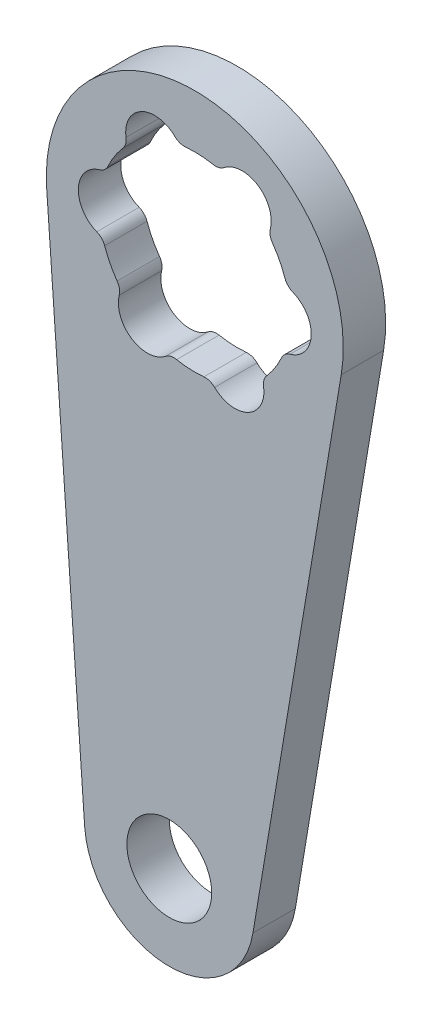
ISO-10303-21;
HEADER;
FILE_DESCRIPTION(('STEP AP214'),'2;1');
FILE_NAME('part.step','',(''),(''),'','','');
FILE_SCHEMA(('AUTOMOTIVE_DESIGN { 1 0 10303 214 1 1 1 1 }'));
ENDSEC;
DATA;
#1=APPLICATION_CONTEXT('core data for automotive mechanical design processes');
#2=APPLICATION_PROTOCOL_DEFINITION('international standard','automotive_design',2000,#1);
#3=PRODUCT_CONTEXT('',#1,'mechanical');
#4=PRODUCT('Part','Part','',(#3));
#5=PRODUCT_RELATED_PRODUCT_CATEGORY('part','',(#4));
#6=PRODUCT_DEFINITION_FORMATION('','',#4);
#7=PRODUCT_DEFINITION_CONTEXT('part definition',#1,'design');
#8=PRODUCT_DEFINITION('design','',#6,#7);
#9=PRODUCT_DEFINITION_SHAPE('','',#8);
#10=(LENGTH_UNIT() NAMED_UNIT(*) SI_UNIT(.MILLI.,.METRE.));
#11=(NAMED_UNIT(*) PLANE_ANGLE_UNIT() SI_UNIT($,.RADIAN.));
#12=(NAMED_UNIT(*) SI_UNIT($,.STERADIAN.) SOLID_ANGLE_UNIT());
#13=UNCERTAINTY_MEASURE_WITH_UNIT(LENGTH_MEASURE(1.E-05),#10,'distance_accuracy_value','');
#14=(GEOMETRIC_REPRESENTATION_CONTEXT(3) GLOBAL_UNCERTAINTY_ASSIGNED_CONTEXT((#13)) GLOBAL_UNIT_ASSIGNED_CONTEXT((#10,
#11,#12)) REPRESENTATION_CONTEXT('',''));
#15=CARTESIAN_POINT('',(0.,0.,0.));
#16=DIRECTION('',(0.,0.,1.));
#17=DIRECTION('',(1.,0.,0.));
#18=AXIS2_PLACEMENT_3D('',#15,#16,#17);
#19=CARTESIAN_POINT('',(0.,0.,6.35));
#20=DIRECTION('',(0.,0.,1.));
#21=DIRECTION('',(1.,0.,0.));
#22=AXIS2_PLACEMENT_3D('',#19,#20,#21);
#23=PLANE('',#22);
#24=CARTESIAN_POINT('',(593.076570191679,141.443139244974,6.35));
#25=DIRECTION('',(0.,0.,1.));
#26=DIRECTION('',(1.,0.,0.));
#27=AXIS2_PLACEMENT_3D('',#24,#25,#26);
#28=CIRCLE('',#27,12.7);
#29=CARTESIAN_POINT('',(580.408587851483,140.541904853447,6.35));
#30=VERTEX_POINT('',#29);
#31=CARTESIAN_POINT('',(605.602465963349,139.347444821335,6.35));
#32=VERTEX_POINT('',#31);
#33=EDGE_CURVE('E255',#30,#32,#28,.T.);
#34=ORIENTED_EDGE('',*,*,#33,.T.);
#35=DIRECTION('',(-0.165015308947933,-0.986291005643273,0.));
#36=VECTOR('',#35,1.);
#37=CARTESIAN_POINT('',(566.432648497293,-94.7692495979055,6.35));
#38=LINE('',#37,#36);
#39=CARTESIAN_POINT('',(618.815660151099,218.322266407784,6.35));
#40=VERTEX_POINT('',#39);
#41=EDGE_CURVE('E259',#40,#32,#38,.T.);
#42=ORIENTED_EDGE('',*,*,#41,.F.);
#43=CARTESIAN_POINT('',(596.895342550677,221.989731649152,6.35));
#44=DIRECTION('',(0.,0.,1.));
#45=DIRECTION('',(1.,0.,0.));
#46=AXIS2_PLACEMENT_3D('',#43,#44,#45);
#47=CIRCLE('',#46,22.225);
#48=CARTESIAN_POINT('',(574.726373455333,220.412571463979,6.35));
#49=VERTEX_POINT('',#48);
#50=EDGE_CURVE('E280',#40,#49,#47,.T.);
#51=ORIENTED_EDGE('',*,*,#50,.T.);
#52=DIRECTION('',(0.0709633379155479,-0.997478924424914,0.));
#53=VECTOR('',#52,1.);
#54=CARTESIAN_POINT('',(587.433948181567,41.7916336346723,6.35));
#55=LINE('',#54,#53);
#56=EDGE_CURVE('E261',#49,#30,#55,.T.);
#57=ORIENTED_EDGE('',*,*,#56,.T.);
#58=EDGE_LOOP('',(#34,#42,#51,#57));
#59=FACE_BOUND('',#58,.T.);
#60=CARTESIAN_POINT('',(593.076570191679,141.443139244974,6.35));
#61=DIRECTION('',(0.,0.,1.));
#62=DIRECTION('',(1.,0.,0.));
#63=AXIS2_PLACEMENT_3D('',#60,#61,#62);
#64=CIRCLE('',#63,6.34999999999994);
#65=CARTESIAN_POINT('',(599.426570191679,141.443139244974,6.35));
#66=VERTEX_POINT('',#65);
#67=EDGE_CURVE('E305',#66,#66,#64,.T.);
#68=ORIENTED_EDGE('',*,*,#67,.F.);
#69=EDGE_LOOP('',(#68));
#70=FACE_BOUND('',#69,.T.);
#71=CARTESIAN_POINT('',(603.982524474659,233.003358987227,6.35));
#72=DIRECTION('',(0.,0.,1.));
#73=DIRECTION('',(1.,0.,0.));
#74=AXIS2_PLACEMENT_3D('',#71,#72,#73);
#75=CIRCLE('',#74,4.35292499999991);
#76=CARTESIAN_POINT('',(608.204995238954,231.945674393266,6.35));
#77=VERTEX_POINT('',#76);
#78=CARTESIAN_POINT('',(601.270344718915,236.408067055205,6.35));
#79=VERTEX_POINT('',#78);
#80=EDGE_CURVE('E311',#77,#79,#75,.T.);
#81=ORIENTED_EDGE('',*,*,#80,.F.);
#82=CARTESIAN_POINT('',(610.176097565101,231.451933955531,6.35));
#83=DIRECTION('',(0.,0.,1.));
#84=DIRECTION('',(1.,0.,0.));
#85=AXIS2_PLACEMENT_3D('',#82,#83,#84);
#86=CIRCLE('',#85,2.032);
#87=CARTESIAN_POINT('',(608.521174821871,230.272843325452,6.35));
#88=VERTEX_POINT('',#87);
#89=EDGE_CURVE('E401',#77,#88,#86,.T.);
#90=ORIENTED_EDGE('',*,*,#89,.T.);
#91=CARTESIAN_POINT('',(596.895342550677,221.989731649152,6.35));
#92=DIRECTION('',(0.,0.,1.));
#93=DIRECTION('',(1.,0.,0.));
#94=AXIS2_PLACEMENT_3D('',#91,#92,#93);
#95=CIRCLE('',#94,14.2748000000001);
#96=CARTESIAN_POINT('',(610.391687265941,226.639311669622,6.35));
#97=VERTEX_POINT('',#96);
#98=EDGE_CURVE('E291',#97,#88,#95,.T.);
#99=ORIENTED_EDGE('',*,*,#98,.F.);
#100=CARTESIAN_POINT('',(612.312875125765,227.301173594244,6.35));
#101=DIRECTION('',(0.,0.,1.));
#102=DIRECTION('',(1.,0.,0.));
#103=AXIS2_PLACEMENT_3D('',#100,#101,#102);
#104=CIRCLE('',#103,2.032);
#105=CARTESIAN_POINT('',(611.569488376722,225.410036332873,6.35));
#106=VERTEX_POINT('',#105);
#107=EDGE_CURVE('E382',#97,#106,#104,.T.);
#108=ORIENTED_EDGE('',*,*,#107,.T.);
#109=CARTESIAN_POINT('',(609.977014575256,221.358865730779,6.35));
#110=DIRECTION('',(0.,0.,1.));
#111=DIRECTION('',(1.,0.,0.));
#112=AXIS2_PLACEMENT_3D('',#109,#110,#111);
#113=CIRCLE('',#112,4.35292500000003);
#114=CARTESIAN_POINT('',(611.172268229842,217.173256485182,6.35));
#115=VERTEX_POINT('',#114);
#116=EDGE_CURVE('E456',#115,#106,#113,.T.);
#117=ORIENTED_EDGE('',*,*,#116,.F.);
#118=CARTESIAN_POINT('',(611.730227630961,215.219361578412,6.35));
#119=DIRECTION('',(0.,0.,1.));
#120=DIRECTION('',(1.,0.,0.));
#121=AXIS2_PLACEMENT_3D('',#118,#119,#120);
#122=CIRCLE('',#121,2.032);
#123=CARTESIAN_POINT('',(609.881643820334,216.063021400311,6.35));
#124=VERTEX_POINT('',#123);
#125=EDGE_CURVE('E384',#115,#124,#122,.T.);
#126=ORIENTED_EDGE('',*,*,#125,.T.);
#127=CARTESIAN_POINT('',(607.670169322965,212.626344277736,6.35));
#128=VERTEX_POINT('',#127);
#129=EDGE_CURVE('E297',#128,#124,#95,.T.);
#130=ORIENTED_EDGE('',*,*,#129,.F.);
#131=CARTESIAN_POINT('',(609.203952493397,211.293477747997,6.35));
#132=DIRECTION('',(0.,0.,1.));
#133=DIRECTION('',(1.,0.,0.));
#134=AXIS2_PLACEMENT_3D('',#131,#132,#133);
#135=CIRCLE('',#134,2.032);
#136=CARTESIAN_POINT('',(607.194486208485,210.991700926819,6.35));
#137=VERTEX_POINT('',#136);
#138=EDGE_CURVE('E386',#128,#137,#135,.T.);
#139=ORIENTED_EDGE('',*,*,#138,.T.);
#140=CARTESIAN_POINT('',(602.889832651274,210.345238392703,6.35));
#141=DIRECTION('',(0.,0.,1.));
#142=DIRECTION('',(1.,0.,0.));
#143=AXIS2_PLACEMENT_3D('',#140,#141,#142);
#144=CIRCLE('',#143,4.35292499999991);
#145=CARTESIAN_POINT('',(599.862615541565,207.217313741068,6.35));
#146=VERTEX_POINT('',#145);
#147=EDGE_CURVE('E293',#146,#137,#144,.T.);
#148=ORIENTED_EDGE('',*,*,#147,.F.);
#149=CARTESIAN_POINT('',(598.449472616536,205.757159272033,6.35));
#150=DIRECTION('',(0.,0.,1.));
#151=DIRECTION('',(1.,0.,0.));
#152=AXIS2_PLACEMENT_3D('',#149,#150,#151);
#153=CIRCLE('',#152,2.032);
#154=CARTESIAN_POINT('',(598.255811549139,207.779909724011,6.35));
#155=VERTEX_POINT('',#154);
#156=EDGE_CURVE('E388',#146,#155,#153,.T.);
#157=ORIENTED_EDGE('',*,*,#156,.T.);
#158=CARTESIAN_POINT('',(594.1738246077,207.976764257266,6.35));
#159=VERTEX_POINT('',#158);
#160=EDGE_CURVE('E296',#159,#155,#95,.T.);
#161=ORIENTED_EDGE('',*,*,#160,.F.);
#162=CARTESIAN_POINT('',(593.786419918309,205.982035802905,6.35));
#163=DIRECTION('',(0.,0.,1.));
#164=DIRECTION('',(1.,0.,0.));
#165=AXIS2_PLACEMENT_3D('',#162,#163,#164);
#166=CIRCLE('',#165,2.032);
#167=CARTESIAN_POINT('',(592.520340382439,207.571396243099,6.35));
#168=VERTEX_POINT('',#167);
#169=EDGE_CURVE('E390',#159,#168,#166,.T.);
#170=ORIENTED_EDGE('',*,*,#169,.T.);
#171=CARTESIAN_POINT('',(589.808160626695,210.976104311076,6.35));
#172=DIRECTION('',(0.,0.,1.));
#173=DIRECTION('',(1.,0.,0.));
#174=AXIS2_PLACEMENT_3D('',#171,#172,#173);
#175=CIRCLE('',#174,4.35292499999991);
#176=CARTESIAN_POINT('',(585.5856898624,212.033788905038,6.35));
#177=VERTEX_POINT('',#176);
#178=EDGE_CURVE('E298',#177,#168,#175,.T.);
#179=ORIENTED_EDGE('',*,*,#178,.F.);
#180=CARTESIAN_POINT('',(583.614587536252,212.527529342773,6.35));
#181=DIRECTION('',(0.,0.,1.));
#182=DIRECTION('',(1.,0.,0.));
#183=AXIS2_PLACEMENT_3D('',#180,#181,#182);
#184=CIRCLE('',#183,2.032);
#185=CARTESIAN_POINT('',(585.269510279483,213.706619972851,6.35));
#186=VERTEX_POINT('',#185);
#187=EDGE_CURVE('E392',#177,#186,#184,.T.);
#188=ORIENTED_EDGE('',*,*,#187,.T.);
#189=CARTESIAN_POINT('',(583.398997835412,217.340151628682,6.35));
#190=VERTEX_POINT('',#189);
#191=EDGE_CURVE('E301',#190,#186,#95,.T.);
#192=ORIENTED_EDGE('',*,*,#191,.F.);
#193=CARTESIAN_POINT('',(581.477809975588,216.67828970406,6.35));
#194=DIRECTION('',(0.,0.,1.));
#195=DIRECTION('',(1.,0.,0.));
#196=AXIS2_PLACEMENT_3D('',#193,#194,#195);
#197=CIRCLE('',#196,2.032);
#198=CARTESIAN_POINT('',(582.221196724631,218.569426965431,6.35));
#199=VERTEX_POINT('',#198);
#200=EDGE_CURVE('E380',#190,#199,#197,.T.);
#201=ORIENTED_EDGE('',*,*,#200,.T.);
#202=CARTESIAN_POINT('',(583.813670526098,222.620597567525,6.35));
#203=DIRECTION('',(0.,0.,1.));
#204=DIRECTION('',(1.,0.,0.));
#205=AXIS2_PLACEMENT_3D('',#202,#203,#204);
#206=CIRCLE('',#205,4.35292499999991);
#207=CARTESIAN_POINT('',(582.618416871512,226.806206813121,6.35));
#208=VERTEX_POINT('',#207);
#209=EDGE_CURVE('E302',#208,#199,#206,.T.);
#210=ORIENTED_EDGE('',*,*,#209,.F.);
#211=CARTESIAN_POINT('',(582.060457470393,228.760101719892,6.35));
#212=DIRECTION('',(0.,0.,1.));
#213=DIRECTION('',(1.,0.,0.));
#214=AXIS2_PLACEMENT_3D('',#211,#212,#213);
#215=CIRCLE('',#214,2.032);
#216=CARTESIAN_POINT('',(583.90904128102,227.916441897993,6.35));
#217=VERTEX_POINT('',#216);
#218=EDGE_CURVE('E394',#208,#217,#215,.T.);
#219=ORIENTED_EDGE('',*,*,#218,.T.);
#220=CARTESIAN_POINT('',(586.120515778389,231.353119020568,6.35));
#221=VERTEX_POINT('',#220);
#222=EDGE_CURVE('E292',#221,#217,#95,.T.);
#223=ORIENTED_EDGE('',*,*,#222,.F.);
#224=CARTESIAN_POINT('',(584.586732607957,232.685985550307,6.35));
#225=DIRECTION('',(0.,0.,1.));
#226=DIRECTION('',(1.,0.,0.));
#227=AXIS2_PLACEMENT_3D('',#224,#225,#226);
#228=CIRCLE('',#227,2.032);
#229=CARTESIAN_POINT('',(586.596198892869,232.987762371484,6.35));
#230=VERTEX_POINT('',#229);
#231=EDGE_CURVE('E396',#221,#230,#228,.T.);
#232=ORIENTED_EDGE('',*,*,#231,.T.);
#233=CARTESIAN_POINT('',(590.90085245008,233.6342249056,6.35));
#234=DIRECTION('',(0.,0.,1.));
#235=DIRECTION('',(1.,0.,0.));
#236=AXIS2_PLACEMENT_3D('',#233,#234,#235);
#237=CIRCLE('',#236,4.3529249999998);
#238=CARTESIAN_POINT('',(593.928069559789,236.762149557236,6.35));
#239=VERTEX_POINT('',#238);
#240=EDGE_CURVE('E286',#239,#230,#237,.T.);
#241=ORIENTED_EDGE('',*,*,#240,.F.);
#242=CARTESIAN_POINT('',(595.341212484817,238.22230402627,6.35));
#243=DIRECTION('',(0.,0.,1.));
#244=DIRECTION('',(1.,0.,0.));
#245=AXIS2_PLACEMENT_3D('',#242,#243,#244);
#246=CIRCLE('',#245,2.032);
#247=CARTESIAN_POINT('',(595.534873552214,236.199553574293,6.35));
#248=VERTEX_POINT('',#247);
#249=EDGE_CURVE('E84',#239,#248,#246,.T.);
#250=ORIENTED_EDGE('',*,*,#249,.T.);
#251=CARTESIAN_POINT('',(599.616860493654,236.002699041038,6.35));
#252=VERTEX_POINT('',#251);
#253=EDGE_CURVE('E289',#252,#248,#95,.T.);
#254=ORIENTED_EDGE('',*,*,#253,.F.);
#255=CARTESIAN_POINT('',(600.004265183045,237.997427495399,6.35));
#256=DIRECTION('',(0.,0.,1.));
#257=DIRECTION('',(1.,0.,0.));
#258=AXIS2_PLACEMENT_3D('',#255,#256,#257);
#259=CIRCLE('',#258,2.032);
#260=EDGE_CURVE('E399',#252,#79,#259,.T.);
#261=ORIENTED_EDGE('',*,*,#260,.T.);
#262=EDGE_LOOP('',(#81,#90,#99,#108,#117,#126,#130,#139,#148,#157,#161,#170,#179,#188,#192,#201,
#210,#219,#223,#232,#241,#250,#254,#261));
#263=FACE_BOUND('',#262,.T.);
#264=ADVANCED_FACE('F69',(#59,#70,#263),#23,.T.);
#265=CARTESIAN_POINT('',(0.,0.,0.));
#266=DIRECTION('',(0.,0.,1.));
#267=DIRECTION('',(1.,0.,0.));
#268=AXIS2_PLACEMENT_3D('',#265,#266,#267);
#269=PLANE('',#268);
#270=CARTESIAN_POINT('',(593.076570191679,141.443139244974,0.));
#271=DIRECTION('',(0.,0.,1.));
#272=DIRECTION('',(1.,0.,0.));
#273=AXIS2_PLACEMENT_3D('',#270,#271,#272);
#274=CIRCLE('',#273,12.7);
#275=CARTESIAN_POINT('',(580.408587851483,140.541904853447,0.));
#276=VERTEX_POINT('',#275);
#277=CARTESIAN_POINT('',(605.602465963349,139.347444821335,0.));
#278=VERTEX_POINT('',#277);
#279=EDGE_CURVE('E271',#276,#278,#274,.T.);
#280=ORIENTED_EDGE('',*,*,#279,.F.);
#281=DIRECTION('',(0.0709633379155479,-0.997478924424914,0.));
#282=VECTOR('',#281,1.);
#283=CARTESIAN_POINT('',(587.433948181567,41.7916336346723,0.));
#284=LINE('',#283,#282);
#285=CARTESIAN_POINT('',(574.726373455333,220.412571463979,0.));
#286=VERTEX_POINT('',#285);
#287=EDGE_CURVE('E315',#286,#276,#284,.T.);
#288=ORIENTED_EDGE('',*,*,#287,.F.);
#289=CARTESIAN_POINT('',(596.895342550677,221.989731649152,0.));
#290=DIRECTION('',(0.,0.,1.));
#291=DIRECTION('',(1.,0.,0.));
#292=AXIS2_PLACEMENT_3D('',#289,#290,#291);
#293=CIRCLE('',#292,22.225);
#294=CARTESIAN_POINT('',(618.815660151099,218.322266407784,0.));
#295=VERTEX_POINT('',#294);
#296=EDGE_CURVE('E313',#295,#286,#293,.T.);
#297=ORIENTED_EDGE('',*,*,#296,.F.);
#298=DIRECTION('',(-0.165015308947933,-0.986291005643273,0.));
#299=VECTOR('',#298,1.);
#300=CARTESIAN_POINT('',(566.432648497293,-94.7692495979055,0.));
#301=LINE('',#300,#299);
#302=EDGE_CURVE('E310',#295,#278,#301,.T.);
#303=ORIENTED_EDGE('',*,*,#302,.T.);
#304=EDGE_LOOP('',(#280,#288,#297,#303));
#305=FACE_BOUND('',#304,.T.);
#306=CARTESIAN_POINT('',(593.076570191679,141.443139244974,0.));
#307=DIRECTION('',(0.,0.,1.));
#308=DIRECTION('',(1.,0.,0.));
#309=AXIS2_PLACEMENT_3D('',#306,#307,#308);
#310=CIRCLE('',#309,6.34999999999994);
#311=CARTESIAN_POINT('',(599.426570191679,141.443139244974,0.));
#312=VERTEX_POINT('',#311);
#313=EDGE_CURVE('E265',#312,#312,#310,.T.);
#314=ORIENTED_EDGE('',*,*,#313,.T.);
#315=EDGE_LOOP('',(#314));
#316=FACE_BOUND('',#315,.T.);
#317=CARTESIAN_POINT('',(596.895342550677,221.989731649152,0.));
#318=DIRECTION('',(0.,0.,1.));
#319=DIRECTION('',(1.,0.,0.));
#320=AXIS2_PLACEMENT_3D('',#317,#318,#319);
#321=CIRCLE('',#320,14.2748000000001);
#322=CARTESIAN_POINT('',(610.391687265941,226.639311669622,0.));
#323=VERTEX_POINT('',#322);
#324=CARTESIAN_POINT('',(608.521174821871,230.272843325452,0.));
#325=VERTEX_POINT('',#324);
#326=EDGE_CURVE('E325',#323,#325,#321,.T.);
#327=ORIENTED_EDGE('',*,*,#326,.T.);
#328=CARTESIAN_POINT('',(610.176097565101,231.451933955531,0.));
#329=DIRECTION('',(0.,0.,1.));
#330=DIRECTION('',(1.,0.,0.));
#331=AXIS2_PLACEMENT_3D('',#328,#329,#330);
#332=CIRCLE('',#331,2.032);
#333=CARTESIAN_POINT('',(608.204995238954,231.945674393266,0.));
#334=VERTEX_POINT('',#333);
#335=EDGE_CURVE('E373',#325,#334,#332,.F.);
#336=ORIENTED_EDGE('',*,*,#335,.T.);
#337=CARTESIAN_POINT('',(603.982524474659,233.003358987227,0.));
#338=DIRECTION('',(0.,0.,1.));
#339=DIRECTION('',(1.,0.,0.));
#340=AXIS2_PLACEMENT_3D('',#337,#338,#339);
#341=CIRCLE('',#340,4.35292499999991);
#342=CARTESIAN_POINT('',(601.270344718915,236.408067055205,0.));
#343=VERTEX_POINT('',#342);
#344=EDGE_CURVE('E275',#343,#334,#341,.F.);
#345=ORIENTED_EDGE('',*,*,#344,.F.);
#346=CARTESIAN_POINT('',(600.004265183045,237.997427495399,0.));
#347=DIRECTION('',(0.,0.,1.));
#348=DIRECTION('',(1.,0.,0.));
#349=AXIS2_PLACEMENT_3D('',#346,#347,#348);
#350=CIRCLE('',#349,2.032);
#351=CARTESIAN_POINT('',(599.616860493654,236.002699041038,0.));
#352=VERTEX_POINT('',#351);
#353=EDGE_CURVE('E371',#343,#352,#350,.F.);
#354=ORIENTED_EDGE('',*,*,#353,.T.);
#355=CARTESIAN_POINT('',(595.534873552214,236.199553574293,0.));
#356=VERTEX_POINT('',#355);
#357=EDGE_CURVE('E320',#352,#356,#321,.T.);
#358=ORIENTED_EDGE('',*,*,#357,.T.);
#359=CARTESIAN_POINT('',(595.341212484817,238.22230402627,0.));
#360=DIRECTION('',(0.,0.,1.));
#361=DIRECTION('',(1.,0.,0.));
#362=AXIS2_PLACEMENT_3D('',#359,#360,#361);
#363=CIRCLE('',#362,2.032);
#364=CARTESIAN_POINT('',(593.928069559789,236.762149557236,0.));
#365=VERTEX_POINT('',#364);
#366=EDGE_CURVE('E369',#356,#365,#363,.F.);
#367=ORIENTED_EDGE('',*,*,#366,.T.);
#368=CARTESIAN_POINT('',(590.90085245008,233.6342249056,0.));
#369=DIRECTION('',(0.,0.,1.));
#370=DIRECTION('',(1.,0.,0.));
#371=AXIS2_PLACEMENT_3D('',#368,#369,#370);
#372=CIRCLE('',#371,4.3529249999998);
#373=CARTESIAN_POINT('',(586.596198892869,232.987762371484,0.));
#374=VERTEX_POINT('',#373);
#375=EDGE_CURVE('E317',#365,#374,#372,.T.);
#376=ORIENTED_EDGE('',*,*,#375,.T.);
#377=CARTESIAN_POINT('',(584.586732607957,232.685985550307,0.));
#378=DIRECTION('',(0.,0.,1.));
#379=DIRECTION('',(1.,0.,0.));
#380=AXIS2_PLACEMENT_3D('',#377,#378,#379);
#381=CIRCLE('',#380,2.032);
#382=CARTESIAN_POINT('',(586.120515778389,231.353119020568,0.));
#383=VERTEX_POINT('',#382);
#384=EDGE_CURVE('E367',#374,#383,#381,.F.);
#385=ORIENTED_EDGE('',*,*,#384,.T.);
#386=CARTESIAN_POINT('',(583.90904128102,227.916441897993,0.));
#387=VERTEX_POINT('',#386);
#388=EDGE_CURVE('E336',#383,#387,#321,.T.);
#389=ORIENTED_EDGE('',*,*,#388,.T.);
#390=CARTESIAN_POINT('',(582.060457470393,228.760101719892,0.));
#391=DIRECTION('',(0.,0.,1.));
#392=DIRECTION('',(1.,0.,0.));
#393=AXIS2_PLACEMENT_3D('',#390,#391,#392);
#394=CIRCLE('',#393,2.032);
#395=CARTESIAN_POINT('',(582.618416871512,226.806206813121,0.));
#396=VERTEX_POINT('',#395);
#397=EDGE_CURVE('E365',#387,#396,#394,.F.);
#398=ORIENTED_EDGE('',*,*,#397,.T.);
#399=CARTESIAN_POINT('',(583.813670526098,222.620597567525,0.));
#400=DIRECTION('',(0.,0.,1.));
#401=DIRECTION('',(1.,0.,0.));
#402=AXIS2_PLACEMENT_3D('',#399,#400,#401);
#403=CIRCLE('',#402,4.35292499999991);
#404=CARTESIAN_POINT('',(582.221196724631,218.569426965431,0.));
#405=VERTEX_POINT('',#404);
#406=EDGE_CURVE('E333',#396,#405,#403,.T.);
#407=ORIENTED_EDGE('',*,*,#406,.T.);
#408=CARTESIAN_POINT('',(581.477809975588,216.67828970406,0.));
#409=DIRECTION('',(0.,0.,1.));
#410=DIRECTION('',(1.,0.,0.));
#411=AXIS2_PLACEMENT_3D('',#408,#409,#410);
#412=CIRCLE('',#411,2.032);
#413=CARTESIAN_POINT('',(583.398997835412,217.340151628682,0.));
#414=VERTEX_POINT('',#413);
#415=EDGE_CURVE('E351',#405,#414,#412,.F.);
#416=ORIENTED_EDGE('',*,*,#415,.T.);
#417=CARTESIAN_POINT('',(585.269510279483,213.706619972851,0.));
#418=VERTEX_POINT('',#417);
#419=EDGE_CURVE('E332',#414,#418,#321,.T.);
#420=ORIENTED_EDGE('',*,*,#419,.T.);
#421=CARTESIAN_POINT('',(583.614587536252,212.527529342773,0.));
#422=DIRECTION('',(0.,0.,1.));
#423=DIRECTION('',(1.,0.,0.));
#424=AXIS2_PLACEMENT_3D('',#421,#422,#423);
#425=CIRCLE('',#424,2.032);
#426=CARTESIAN_POINT('',(585.5856898624,212.033788905038,0.));
#427=VERTEX_POINT('',#426);
#428=EDGE_CURVE('E363',#418,#427,#425,.F.);
#429=ORIENTED_EDGE('',*,*,#428,.T.);
#430=CARTESIAN_POINT('',(589.808160626695,210.976104311076,0.));
#431=DIRECTION('',(0.,0.,1.));
#432=DIRECTION('',(1.,0.,0.));
#433=AXIS2_PLACEMENT_3D('',#430,#431,#432);
#434=CIRCLE('',#433,4.35292499999991);
#435=CARTESIAN_POINT('',(592.520340382439,207.571396243099,0.));
#436=VERTEX_POINT('',#435);
#437=EDGE_CURVE('E329',#427,#436,#434,.T.);
#438=ORIENTED_EDGE('',*,*,#437,.T.);
#439=CARTESIAN_POINT('',(593.786419918309,205.982035802905,0.));
#440=DIRECTION('',(0.,0.,1.));
#441=DIRECTION('',(1.,0.,0.));
#442=AXIS2_PLACEMENT_3D('',#439,#440,#441);
#443=CIRCLE('',#442,2.032);
#444=CARTESIAN_POINT('',(594.1738246077,207.976764257266,0.));
#445=VERTEX_POINT('',#444);
#446=EDGE_CURVE('E361',#436,#445,#443,.F.);
#447=ORIENTED_EDGE('',*,*,#446,.T.);
#448=CARTESIAN_POINT('',(598.255811549139,207.779909724011,0.));
#449=VERTEX_POINT('',#448);
#450=EDGE_CURVE('E326',#445,#449,#321,.T.);
#451=ORIENTED_EDGE('',*,*,#450,.T.);
#452=CARTESIAN_POINT('',(598.449472616536,205.757159272033,0.));
#453=DIRECTION('',(0.,0.,1.));
#454=DIRECTION('',(1.,0.,0.));
#455=AXIS2_PLACEMENT_3D('',#452,#453,#454);
#456=CIRCLE('',#455,2.032);
#457=CARTESIAN_POINT('',(599.862615541565,207.217313741068,0.));
#458=VERTEX_POINT('',#457);
#459=EDGE_CURVE('E359',#449,#458,#456,.F.);
#460=ORIENTED_EDGE('',*,*,#459,.T.);
#461=CARTESIAN_POINT('',(602.889832651274,210.345238392703,0.));
#462=DIRECTION('',(0.,0.,1.));
#463=DIRECTION('',(1.,0.,0.));
#464=AXIS2_PLACEMENT_3D('',#461,#462,#463);
#465=CIRCLE('',#464,4.35292499999991);
#466=CARTESIAN_POINT('',(607.194486208485,210.991700926819,0.));
#467=VERTEX_POINT('',#466);
#468=EDGE_CURVE('E324',#458,#467,#465,.T.);
#469=ORIENTED_EDGE('',*,*,#468,.T.);
#470=CARTESIAN_POINT('',(609.203952493397,211.293477747997,0.));
#471=DIRECTION('',(0.,0.,1.));
#472=DIRECTION('',(1.,0.,0.));
#473=AXIS2_PLACEMENT_3D('',#470,#471,#472);
#474=CIRCLE('',#473,2.032);
#475=CARTESIAN_POINT('',(607.670169322965,212.626344277736,0.));
#476=VERTEX_POINT('',#475);
#477=EDGE_CURVE('E357',#467,#476,#474,.F.);
#478=ORIENTED_EDGE('',*,*,#477,.T.);
#479=CARTESIAN_POINT('',(609.881643820334,216.063021400311,0.));
#480=VERTEX_POINT('',#479);
#481=EDGE_CURVE('E321',#476,#480,#321,.T.);
#482=ORIENTED_EDGE('',*,*,#481,.T.);
#483=CARTESIAN_POINT('',(611.730227630961,215.219361578412,0.));
#484=DIRECTION('',(0.,0.,1.));
#485=DIRECTION('',(1.,0.,0.));
#486=AXIS2_PLACEMENT_3D('',#483,#484,#485);
#487=CIRCLE('',#486,2.032);
#488=CARTESIAN_POINT('',(611.172268229842,217.173256485182,0.));
#489=VERTEX_POINT('',#488);
#490=EDGE_CURVE('E355',#480,#489,#487,.F.);
#491=ORIENTED_EDGE('',*,*,#490,.T.);
#492=CARTESIAN_POINT('',(609.977014575256,221.358865730779,0.));
#493=DIRECTION('',(0.,0.,1.));
#494=DIRECTION('',(1.,0.,0.));
#495=AXIS2_PLACEMENT_3D('',#492,#493,#494);
#496=CIRCLE('',#495,4.35292500000003);
#497=CARTESIAN_POINT('',(611.569488376722,225.410036332873,0.));
#498=VERTEX_POINT('',#497);
#499=EDGE_CURVE('E453',#489,#498,#496,.T.);
#500=ORIENTED_EDGE('',*,*,#499,.T.);
#501=CARTESIAN_POINT('',(612.312875125765,227.301173594244,0.));
#502=DIRECTION('',(0.,0.,1.));
#503=DIRECTION('',(1.,0.,0.));
#504=AXIS2_PLACEMENT_3D('',#501,#502,#503);
#505=CIRCLE('',#504,2.032);
#506=EDGE_CURVE('E353',#498,#323,#505,.F.);
#507=ORIENTED_EDGE('',*,*,#506,.T.);
#508=EDGE_LOOP('',(#327,#336,#345,#354,#358,#367,#376,#385,#389,#398,#407,#416,#420,#429,#438,
#447,#451,#460,#469,#478,#482,#491,#500,#507));
#509=FACE_BOUND('',#508,.T.);
#510=ADVANCED_FACE('F461',(#305,#316,#509),#269,.F.);
#511=CARTESIAN_POINT('',(590.90085245008,233.6342249056,6.35));
#512=DIRECTION('',(0.,0.,-1.));
#513=DIRECTION('',(-1.,0.,0.));
#514=AXIS2_PLACEMENT_3D('',#511,#512,#513);
#515=CYLINDRICAL_SURFACE('',#514,4.3529249999998);
#516=ORIENTED_EDGE('',*,*,#375,.F.);
#517=DIRECTION('',(0.,0.,-1.));
#518=VECTOR('',#517,1.);
#519=CARTESIAN_POINT('',(593.928069559789,236.762149557236,6.35));
#520=LINE('',#519,#518);
#521=EDGE_CURVE('E410',#365,#239,#520,.F.);
#522=ORIENTED_EDGE('',*,*,#521,.T.);
#523=ORIENTED_EDGE('',*,*,#240,.T.);
#524=DIRECTION('',(0.,0.,-1.));
#525=VECTOR('',#524,1.);
#526=CARTESIAN_POINT('',(586.596198892869,232.987762371484,6.35));
#527=LINE('',#526,#525);
#528=EDGE_CURVE('E407',#230,#374,#527,.T.);
#529=ORIENTED_EDGE('',*,*,#528,.T.);
#530=EDGE_LOOP('',(#516,#522,#523,#529));
#531=FACE_BOUND('',#530,.T.);
#532=ADVANCED_FACE('F539',(#531),#515,.F.);
#533=CARTESIAN_POINT('',(596.895342550677,221.989731649152,6.35));
#534=DIRECTION('',(0.,0.,-1.));
#535=DIRECTION('',(-1.,0.,0.));
#536=AXIS2_PLACEMENT_3D('',#533,#534,#535);
#537=CYLINDRICAL_SURFACE('',#536,14.2748000000001);
#538=ORIENTED_EDGE('',*,*,#357,.F.);
#539=DIRECTION('',(0.,0.,-1.));
#540=VECTOR('',#539,1.);
#541=CARTESIAN_POINT('',(599.616860493654,236.002699041038,6.35));
#542=LINE('',#541,#540);
#543=EDGE_CURVE('E91',#352,#252,#542,.F.);
#544=ORIENTED_EDGE('',*,*,#543,.T.);
#545=ORIENTED_EDGE('',*,*,#253,.T.);
#546=DIRECTION('',(0.,0.,-1.));
#547=VECTOR('',#546,1.);
#548=CARTESIAN_POINT('',(595.534873552214,236.199553574293,6.35));
#549=LINE('',#548,#547);
#550=EDGE_CURVE('E403',#248,#356,#549,.T.);
#551=ORIENTED_EDGE('',*,*,#550,.T.);
#552=EDGE_LOOP('',(#538,#544,#545,#551));
#553=FACE_BOUND('',#552,.T.);
#554=ADVANCED_FACE('F477',(#553),#537,.F.);
#555=ORIENTED_EDGE('',*,*,#98,.T.);
#556=DIRECTION('',(0.,0.,-1.));
#557=VECTOR('',#556,1.);
#558=CARTESIAN_POINT('',(608.521174821871,230.272843325452,6.35));
#559=LINE('',#558,#557);
#560=EDGE_CURVE('E348',#88,#325,#559,.T.);
#561=ORIENTED_EDGE('',*,*,#560,.T.);
#562=ORIENTED_EDGE('',*,*,#326,.F.);
#563=DIRECTION('',(0.,0.,-1.));
#564=VECTOR('',#563,1.);
#565=CARTESIAN_POINT('',(610.391687265941,226.639311669622,6.35));
#566=LINE('',#565,#564);
#567=EDGE_CURVE('E346',#323,#97,#566,.F.);
#568=ORIENTED_EDGE('',*,*,#567,.T.);
#569=EDGE_LOOP('',(#555,#561,#562,#568));
#570=FACE_BOUND('',#569,.T.);
#571=ADVANCED_FACE('F619',(#570),#537,.F.);
#572=ORIENTED_EDGE('',*,*,#481,.F.);
#573=DIRECTION('',(0.,0.,-1.));
#574=VECTOR('',#573,1.);
#575=CARTESIAN_POINT('',(607.670169322965,212.626344277736,6.35));
#576=LINE('',#575,#574);
#577=EDGE_CURVE('E445',#476,#128,#576,.F.);
#578=ORIENTED_EDGE('',*,*,#577,.T.);
#579=ORIENTED_EDGE('',*,*,#129,.T.);
#580=DIRECTION('',(0.,0.,-1.));
#581=VECTOR('',#580,1.);
#582=CARTESIAN_POINT('',(609.881643820334,216.063021400311,6.35));
#583=LINE('',#582,#581);
#584=EDGE_CURVE('E442',#124,#480,#583,.T.);
#585=ORIENTED_EDGE('',*,*,#584,.T.);
#586=EDGE_LOOP('',(#572,#578,#579,#585));
#587=FACE_BOUND('',#586,.T.);
#588=ADVANCED_FACE('F560',(#587),#537,.F.);
#589=CARTESIAN_POINT('',(602.889832651274,210.345238392703,6.35));
#590=DIRECTION('',(0.,0.,-1.));
#591=DIRECTION('',(-1.,0.,0.));
#592=AXIS2_PLACEMENT_3D('',#589,#590,#591);
#593=CYLINDRICAL_SURFACE('',#592,4.35292499999991);
#594=ORIENTED_EDGE('',*,*,#468,.F.);
#595=DIRECTION('',(0.,0.,-1.));
#596=VECTOR('',#595,1.);
#597=CARTESIAN_POINT('',(599.862615541565,207.217313741068,6.35));
#598=LINE('',#597,#596);
#599=EDGE_CURVE('E440',#458,#146,#598,.F.);
#600=ORIENTED_EDGE('',*,*,#599,.T.);
#601=ORIENTED_EDGE('',*,*,#147,.T.);
#602=DIRECTION('',(0.,0.,-1.));
#603=VECTOR('',#602,1.);
#604=CARTESIAN_POINT('',(607.194486208485,210.991700926819,6.35));
#605=LINE('',#604,#603);
#606=EDGE_CURVE('E437',#137,#467,#605,.T.);
#607=ORIENTED_EDGE('',*,*,#606,.T.);
#608=EDGE_LOOP('',(#594,#600,#601,#607));
#609=FACE_BOUND('',#608,.T.);
#610=ADVANCED_FACE('F557',(#609),#593,.F.);
#611=ORIENTED_EDGE('',*,*,#450,.F.);
#612=DIRECTION('',(0.,0.,-1.));
#613=VECTOR('',#612,1.);
#614=CARTESIAN_POINT('',(594.1738246077,207.976764257266,6.35));
#615=LINE('',#614,#613);
#616=EDGE_CURVE('E435',#445,#159,#615,.F.);
#617=ORIENTED_EDGE('',*,*,#616,.T.);
#618=ORIENTED_EDGE('',*,*,#160,.T.);
#619=DIRECTION('',(0.,0.,-1.));
#620=VECTOR('',#619,1.);
#621=CARTESIAN_POINT('',(598.255811549139,207.779909724011,6.35));
#622=LINE('',#621,#620);
#623=EDGE_CURVE('E432',#155,#449,#622,.T.);
#624=ORIENTED_EDGE('',*,*,#623,.T.);
#625=EDGE_LOOP('',(#611,#617,#618,#624));
#626=FACE_BOUND('',#625,.T.);
#627=ADVANCED_FACE('F488',(#626),#537,.F.);
#628=CARTESIAN_POINT('',(589.808160626695,210.976104311076,6.35));
#629=DIRECTION('',(0.,0.,-1.));
#630=DIRECTION('',(-1.,0.,0.));
#631=AXIS2_PLACEMENT_3D('',#628,#629,#630);
#632=CYLINDRICAL_SURFACE('',#631,4.35292499999991);
#633=ORIENTED_EDGE('',*,*,#437,.F.);
#634=DIRECTION('',(0.,0.,-1.));
#635=VECTOR('',#634,1.);
#636=CARTESIAN_POINT('',(585.5856898624,212.033788905038,6.35));
#637=LINE('',#636,#635);
#638=EDGE_CURVE('E430',#427,#177,#637,.F.);
#639=ORIENTED_EDGE('',*,*,#638,.T.);
#640=ORIENTED_EDGE('',*,*,#178,.T.);
#641=DIRECTION('',(0.,0.,-1.));
#642=VECTOR('',#641,1.);
#643=CARTESIAN_POINT('',(592.520340382439,207.571396243099,6.35));
#644=LINE('',#643,#642);
#645=EDGE_CURVE('E427',#168,#436,#644,.T.);
#646=ORIENTED_EDGE('',*,*,#645,.T.);
#647=EDGE_LOOP('',(#633,#639,#640,#646));
#648=FACE_BOUND('',#647,.T.);
#649=ADVANCED_FACE('F500',(#648),#632,.F.);
#650=ORIENTED_EDGE('',*,*,#191,.T.);
#651=DIRECTION('',(0.,0.,-1.));
#652=VECTOR('',#651,1.);
#653=CARTESIAN_POINT('',(585.269510279483,213.706619972851,6.35));
#654=LINE('',#653,#652);
#655=EDGE_CURVE('E424',#186,#418,#654,.T.);
#656=ORIENTED_EDGE('',*,*,#655,.T.);
#657=ORIENTED_EDGE('',*,*,#419,.F.);
#658=DIRECTION('',(0.,0.,-1.));
#659=VECTOR('',#658,1.);
#660=CARTESIAN_POINT('',(583.398997835412,217.340151628682,6.35));
#661=LINE('',#660,#659);
#662=EDGE_CURVE('E422',#414,#190,#661,.F.);
#663=ORIENTED_EDGE('',*,*,#662,.T.);
#664=EDGE_LOOP('',(#650,#656,#657,#663));
#665=FACE_BOUND('',#664,.T.);
#666=ADVANCED_FACE('F509',(#665),#537,.F.);
#667=CARTESIAN_POINT('',(583.813670526098,222.620597567525,6.35));
#668=DIRECTION('',(0.,0.,-1.));
#669=DIRECTION('',(-1.,0.,0.));
#670=AXIS2_PLACEMENT_3D('',#667,#668,#669);
#671=CYLINDRICAL_SURFACE('',#670,4.35292499999991);
#672=ORIENTED_EDGE('',*,*,#406,.F.);
#673=DIRECTION('',(0.,0.,-1.));
#674=VECTOR('',#673,1.);
#675=CARTESIAN_POINT('',(582.618416871512,226.806206813121,6.35));
#676=LINE('',#675,#674);
#677=EDGE_CURVE('E420',#396,#208,#676,.F.);
#678=ORIENTED_EDGE('',*,*,#677,.T.);
#679=ORIENTED_EDGE('',*,*,#209,.T.);
#680=DIRECTION('',(0.,0.,-1.));
#681=VECTOR('',#680,1.);
#682=CARTESIAN_POINT('',(582.221196724631,218.569426965431,6.35));
#683=LINE('',#682,#681);
#684=EDGE_CURVE('E417',#199,#405,#683,.T.);
#685=ORIENTED_EDGE('',*,*,#684,.T.);
#686=EDGE_LOOP('',(#672,#678,#679,#685));
#687=FACE_BOUND('',#686,.T.);
#688=ADVANCED_FACE('F524',(#687),#671,.F.);
#689=CARTESIAN_POINT('',(593.076570191679,141.443139244974,6.35));
#690=DIRECTION('',(0.,0.,-1.));
#691=DIRECTION('',(-1.,0.,0.));
#692=AXIS2_PLACEMENT_3D('',#689,#690,#691);
#693=CYLINDRICAL_SURFACE('',#692,12.7);
#694=ORIENTED_EDGE('',*,*,#279,.T.);
#695=DIRECTION('',(0.,0.,-1.));
#696=VECTOR('',#695,1.);
#697=CARTESIAN_POINT('',(605.602465963349,139.347444821335,6.35));
#698=LINE('',#697,#696);
#699=EDGE_CURVE('E268',#32,#278,#698,.T.);
#700=ORIENTED_EDGE('',*,*,#699,.F.);
#701=ORIENTED_EDGE('',*,*,#33,.F.);
#702=DIRECTION('',(0.,0.,-1.));
#703=VECTOR('',#702,1.);
#704=CARTESIAN_POINT('',(580.408587851483,140.541904853447,6.35));
#705=LINE('',#704,#703);
#706=EDGE_CURVE('E308',#30,#276,#705,.T.);
#707=ORIENTED_EDGE('',*,*,#706,.T.);
#708=EDGE_LOOP('',(#694,#700,#701,#707));
#709=FACE_BOUND('',#708,.T.);
#710=ADVANCED_FACE('F269',(#709),#693,.T.);
#711=CARTESIAN_POINT('',(566.432648497293,-94.7692495979055,6.35));
#712=DIRECTION('',(0.986291005643273,-0.165015308947933,0.));
#713=DIRECTION('',(0.165015308947933,0.986291005643273,0.));
#714=AXIS2_PLACEMENT_3D('',#711,#712,#713);
#715=PLANE('',#714);
#716=ORIENTED_EDGE('',*,*,#302,.F.);
#717=DIRECTION('',(0.,0.,-1.));
#718=VECTOR('',#717,1.);
#719=CARTESIAN_POINT('',(618.815660151099,218.322266407784,6.35));
#720=LINE('',#719,#718);
#721=EDGE_CURVE('E276',#40,#295,#720,.T.);
#722=ORIENTED_EDGE('',*,*,#721,.F.);
#723=ORIENTED_EDGE('',*,*,#41,.T.);
#724=ORIENTED_EDGE('',*,*,#699,.T.);
#725=EDGE_LOOP('',(#716,#722,#723,#724));
#726=FACE_BOUND('',#725,.T.);
#727=ADVANCED_FACE('F278',(#726),#715,.T.);
#728=CARTESIAN_POINT('',(596.895342550677,221.989731649152,6.35));
#729=DIRECTION('',(0.,0.,-1.));
#730=DIRECTION('',(-1.,0.,0.));
#731=AXIS2_PLACEMENT_3D('',#728,#729,#730);
#732=CYLINDRICAL_SURFACE('',#731,22.225);
#733=ORIENTED_EDGE('',*,*,#296,.T.);
#734=DIRECTION('',(0.,0.,-1.));
#735=VECTOR('',#734,1.);
#736=CARTESIAN_POINT('',(574.726373455333,220.412571463979,6.35));
#737=LINE('',#736,#735);
#738=EDGE_CURVE('E340',#49,#286,#737,.T.);
#739=ORIENTED_EDGE('',*,*,#738,.F.);
#740=ORIENTED_EDGE('',*,*,#50,.F.);
#741=ORIENTED_EDGE('',*,*,#721,.T.);
#742=EDGE_LOOP('',(#733,#739,#740,#741));
#743=FACE_BOUND('',#742,.T.);
#744=ADVANCED_FACE('F552',(#743),#732,.T.);
#745=ORIENTED_EDGE('',*,*,#388,.F.);
#746=DIRECTION('',(0.,0.,-1.));
#747=VECTOR('',#746,1.);
#748=CARTESIAN_POINT('',(586.120515778389,231.353119020568,6.35));
#749=LINE('',#748,#747);
#750=EDGE_CURVE('E415',#383,#221,#749,.F.);
#751=ORIENTED_EDGE('',*,*,#750,.T.);
#752=ORIENTED_EDGE('',*,*,#222,.T.);
#753=DIRECTION('',(0.,0.,-1.));
#754=VECTOR('',#753,1.);
#755=CARTESIAN_POINT('',(583.90904128102,227.916441897993,6.35));
#756=LINE('',#755,#754);
#757=EDGE_CURVE('E412',#217,#387,#756,.T.);
#758=ORIENTED_EDGE('',*,*,#757,.T.);
#759=EDGE_LOOP('',(#745,#751,#752,#758));
#760=FACE_BOUND('',#759,.T.);
#761=ADVANCED_FACE('F515',(#760),#537,.F.);
#762=CARTESIAN_POINT('',(587.433948181567,41.7916336346723,6.35));
#763=DIRECTION('',(0.997478924424914,0.0709633379155479,0.));
#764=DIRECTION('',(-0.0709633379155479,0.997478924424914,0.));
#765=AXIS2_PLACEMENT_3D('',#762,#763,#764);
#766=PLANE('',#765);
#767=ORIENTED_EDGE('',*,*,#287,.T.);
#768=ORIENTED_EDGE('',*,*,#706,.F.);
#769=ORIENTED_EDGE('',*,*,#56,.F.);
#770=ORIENTED_EDGE('',*,*,#738,.T.);
#771=EDGE_LOOP('',(#767,#768,#769,#770));
#772=FACE_BOUND('',#771,.T.);
#773=ADVANCED_FACE('F548',(#772),#766,.F.);
#774=CARTESIAN_POINT('',(593.076570191679,141.443139244974,6.35));
#775=DIRECTION('',(0.,0.,-1.));
#776=DIRECTION('',(-1.,0.,0.));
#777=AXIS2_PLACEMENT_3D('',#774,#775,#776);
#778=CYLINDRICAL_SURFACE('',#777,6.34999999999994);
#779=ORIENTED_EDGE('',*,*,#67,.T.);
#780=EDGE_LOOP('',(#779));
#781=FACE_BOUND('',#780,.T.);
#782=ORIENTED_EDGE('',*,*,#313,.F.);
#783=EDGE_LOOP('',(#782));
#784=FACE_BOUND('',#783,.T.);
#785=ADVANCED_FACE('F545',(#781,#784),#778,.F.);
#786=CARTESIAN_POINT('',(603.982524474659,233.003358987227,6.35));
#787=DIRECTION('',(0.,0.,-1.));
#788=DIRECTION('',(-1.,0.,0.));
#789=AXIS2_PLACEMENT_3D('',#786,#787,#788);
#790=CYLINDRICAL_SURFACE('',#789,4.35292499999991);
#791=ORIENTED_EDGE('',*,*,#344,.T.);
#792=DIRECTION('',(0.,0.,-1.));
#793=VECTOR('',#792,1.);
#794=CARTESIAN_POINT('',(608.204995238954,231.945674393266,6.35));
#795=LINE('',#794,#793);
#796=EDGE_CURVE('E378',#334,#77,#795,.F.);
#797=ORIENTED_EDGE('',*,*,#796,.T.);
#798=ORIENTED_EDGE('',*,*,#80,.T.);
#799=DIRECTION('',(0.,0.,-1.));
#800=VECTOR('',#799,1.);
#801=CARTESIAN_POINT('',(601.270344718915,236.408067055205,6.35));
#802=LINE('',#801,#800);
#803=EDGE_CURVE('E375',#79,#343,#802,.T.);
#804=ORIENTED_EDGE('',*,*,#803,.T.);
#805=EDGE_LOOP('',(#791,#797,#798,#804));
#806=FACE_BOUND('',#805,.T.);
#807=ADVANCED_FACE('F469',(#806),#790,.F.);
#808=CARTESIAN_POINT('',(609.977014575256,221.358865730779,6.35));
#809=DIRECTION('',(0.,0.,-1.));
#810=DIRECTION('',(-1.,0.,0.));
#811=AXIS2_PLACEMENT_3D('',#808,#809,#810);
#812=CYLINDRICAL_SURFACE('',#811,4.35292500000003);
#813=ORIENTED_EDGE('',*,*,#499,.F.);
#814=DIRECTION('',(0.,0.,-1.));
#815=VECTOR('',#814,1.);
#816=CARTESIAN_POINT('',(611.172268229842,217.173256485182,6.35));
#817=LINE('',#816,#815);
#818=EDGE_CURVE('E12',#489,#115,#817,.F.);
#819=ORIENTED_EDGE('',*,*,#818,.T.);
#820=ORIENTED_EDGE('',*,*,#116,.T.);
#821=DIRECTION('',(0.,0.,-1.));
#822=VECTOR('',#821,1.);
#823=CARTESIAN_POINT('',(611.569488376722,225.410036332873,6.35));
#824=LINE('',#823,#822);
#825=EDGE_CURVE('E77',#106,#498,#824,.T.);
#826=ORIENTED_EDGE('',*,*,#825,.T.);
#827=EDGE_LOOP('',(#813,#819,#820,#826));
#828=FACE_BOUND('',#827,.T.);
#829=ADVANCED_FACE('F452',(#828),#812,.F.);
#830=CARTESIAN_POINT('',(610.176097565101,231.451933955531,6.35));
#831=DIRECTION('',(0.,0.,-1.));
#832=DIRECTION('',(-1.,0.,0.));
#833=AXIS2_PLACEMENT_3D('',#830,#831,#832);
#834=CYLINDRICAL_SURFACE('',#833,2.032);
#835=ORIENTED_EDGE('',*,*,#89,.F.);
#836=ORIENTED_EDGE('',*,*,#796,.F.);
#837=ORIENTED_EDGE('',*,*,#335,.F.);
#838=ORIENTED_EDGE('',*,*,#560,.F.);
#839=EDGE_LOOP('',(#835,#836,#837,#838));
#840=FACE_BOUND('',#839,.T.);
#841=ADVANCED_FACE('F575',(#840),#834,.T.);
#842=CARTESIAN_POINT('',(600.004265183045,237.997427495399,6.35));
#843=DIRECTION('',(0.,0.,-1.));
#844=DIRECTION('',(-1.,0.,0.));
#845=AXIS2_PLACEMENT_3D('',#842,#843,#844);
#846=CYLINDRICAL_SURFACE('',#845,2.032);
#847=ORIENTED_EDGE('',*,*,#260,.F.);
#848=ORIENTED_EDGE('',*,*,#543,.F.);
#849=ORIENTED_EDGE('',*,*,#353,.F.);
#850=ORIENTED_EDGE('',*,*,#803,.F.);
#851=EDGE_LOOP('',(#847,#848,#849,#850));
#852=FACE_BOUND('',#851,.T.);
#853=ADVANCED_FACE('F475',(#852),#846,.T.);
#854=CARTESIAN_POINT('',(595.341212484817,238.22230402627,6.35));
#855=DIRECTION('',(0.,0.,-1.));
#856=DIRECTION('',(-1.,0.,0.));
#857=AXIS2_PLACEMENT_3D('',#854,#855,#856);
#858=CYLINDRICAL_SURFACE('',#857,2.032);
#859=ORIENTED_EDGE('',*,*,#249,.F.);
#860=ORIENTED_EDGE('',*,*,#521,.F.);
#861=ORIENTED_EDGE('',*,*,#366,.F.);
#862=ORIENTED_EDGE('',*,*,#550,.F.);
#863=EDGE_LOOP('',(#859,#860,#861,#862));
#864=FACE_BOUND('',#863,.T.);
#865=ADVANCED_FACE('F581',(#864),#858,.T.);
#866=CARTESIAN_POINT('',(584.586732607957,232.685985550307,6.35));
#867=DIRECTION('',(0.,0.,-1.));
#868=DIRECTION('',(-1.,0.,0.));
#869=AXIS2_PLACEMENT_3D('',#866,#867,#868);
#870=CYLINDRICAL_SURFACE('',#869,2.032);
#871=ORIENTED_EDGE('',*,*,#231,.F.);
#872=ORIENTED_EDGE('',*,*,#750,.F.);
#873=ORIENTED_EDGE('',*,*,#384,.F.);
#874=ORIENTED_EDGE('',*,*,#528,.F.);
#875=EDGE_LOOP('',(#871,#872,#873,#874));
#876=FACE_BOUND('',#875,.T.);
#877=ADVANCED_FACE('F584',(#876),#870,.T.);
#878=CARTESIAN_POINT('',(582.060457470393,228.760101719892,6.35));
#879=DIRECTION('',(0.,0.,-1.));
#880=DIRECTION('',(-1.,0.,0.));
#881=AXIS2_PLACEMENT_3D('',#878,#879,#880);
#882=CYLINDRICAL_SURFACE('',#881,2.032);
#883=ORIENTED_EDGE('',*,*,#218,.F.);
#884=ORIENTED_EDGE('',*,*,#677,.F.);
#885=ORIENTED_EDGE('',*,*,#397,.F.);
#886=ORIENTED_EDGE('',*,*,#757,.F.);
#887=EDGE_LOOP('',(#883,#884,#885,#886));
#888=FACE_BOUND('',#887,.T.);
#889=ADVANCED_FACE('F520',(#888),#882,.T.);
#890=CARTESIAN_POINT('',(583.614587536252,212.527529342773,6.35));
#891=DIRECTION('',(0.,0.,-1.));
#892=DIRECTION('',(-1.,0.,0.));
#893=AXIS2_PLACEMENT_3D('',#890,#891,#892);
#894=CYLINDRICAL_SURFACE('',#893,2.032);
#895=ORIENTED_EDGE('',*,*,#187,.F.);
#896=ORIENTED_EDGE('',*,*,#638,.F.);
#897=ORIENTED_EDGE('',*,*,#428,.F.);
#898=ORIENTED_EDGE('',*,*,#655,.F.);
#899=EDGE_LOOP('',(#895,#896,#897,#898));
#900=FACE_BOUND('',#899,.T.);
#901=ADVANCED_FACE('F503',(#900),#894,.T.);
#902=CARTESIAN_POINT('',(593.786419918309,205.982035802905,6.35));
#903=DIRECTION('',(0.,0.,-1.));
#904=DIRECTION('',(-1.,0.,0.));
#905=AXIS2_PLACEMENT_3D('',#902,#903,#904);
#906=CYLINDRICAL_SURFACE('',#905,2.032);
#907=ORIENTED_EDGE('',*,*,#169,.F.);
#908=ORIENTED_EDGE('',*,*,#616,.F.);
#909=ORIENTED_EDGE('',*,*,#446,.F.);
#910=ORIENTED_EDGE('',*,*,#645,.F.);
#911=EDGE_LOOP('',(#907,#908,#909,#910));
#912=FACE_BOUND('',#911,.T.);
#913=ADVANCED_FACE('F494',(#912),#906,.T.);
#914=CARTESIAN_POINT('',(598.449472616536,205.757159272033,6.35));
#915=DIRECTION('',(0.,0.,-1.));
#916=DIRECTION('',(-1.,0.,0.));
#917=AXIS2_PLACEMENT_3D('',#914,#915,#916);
#918=CYLINDRICAL_SURFACE('',#917,2.032);
#919=ORIENTED_EDGE('',*,*,#156,.F.);
#920=ORIENTED_EDGE('',*,*,#599,.F.);
#921=ORIENTED_EDGE('',*,*,#459,.F.);
#922=ORIENTED_EDGE('',*,*,#623,.F.);
#923=EDGE_LOOP('',(#919,#920,#921,#922));
#924=FACE_BOUND('',#923,.T.);
#925=ADVANCED_FACE('F595',(#924),#918,.T.);
#926=CARTESIAN_POINT('',(609.203952493397,211.293477747997,6.35));
#927=DIRECTION('',(0.,0.,-1.));
#928=DIRECTION('',(-1.,0.,0.));
#929=AXIS2_PLACEMENT_3D('',#926,#927,#928);
#930=CYLINDRICAL_SURFACE('',#929,2.032);
#931=ORIENTED_EDGE('',*,*,#138,.F.);
#932=ORIENTED_EDGE('',*,*,#577,.F.);
#933=ORIENTED_EDGE('',*,*,#477,.F.);
#934=ORIENTED_EDGE('',*,*,#606,.F.);
#935=EDGE_LOOP('',(#931,#932,#933,#934));
#936=FACE_BOUND('',#935,.T.);
#937=ADVANCED_FACE('F598',(#936),#930,.T.);
#938=CARTESIAN_POINT('',(611.730227630961,215.219361578412,6.35));
#939=DIRECTION('',(0.,0.,-1.));
#940=DIRECTION('',(-1.,0.,0.));
#941=AXIS2_PLACEMENT_3D('',#938,#939,#940);
#942=CYLINDRICAL_SURFACE('',#941,2.032);
#943=ORIENTED_EDGE('',*,*,#125,.F.);
#944=ORIENTED_EDGE('',*,*,#818,.F.);
#945=ORIENTED_EDGE('',*,*,#490,.F.);
#946=ORIENTED_EDGE('',*,*,#584,.F.);
#947=EDGE_LOOP('',(#943,#944,#945,#946));
#948=FACE_BOUND('',#947,.T.);
#949=ADVANCED_FACE('F533',(#948),#942,.T.);
#950=CARTESIAN_POINT('',(612.312875125765,227.301173594244,6.35));
#951=DIRECTION('',(0.,0.,-1.));
#952=DIRECTION('',(-1.,0.,0.));
#953=AXIS2_PLACEMENT_3D('',#950,#951,#952);
#954=CYLINDRICAL_SURFACE('',#953,2.032);
#955=ORIENTED_EDGE('',*,*,#107,.F.);
#956=ORIENTED_EDGE('',*,*,#567,.F.);
#957=ORIENTED_EDGE('',*,*,#506,.F.);
#958=ORIENTED_EDGE('',*,*,#825,.F.);
#959=EDGE_LOOP('',(#955,#956,#957,#958));
#960=FACE_BOUND('',#959,.T.);
#961=ADVANCED_FACE('F529',(#960),#954,.T.);
#962=CARTESIAN_POINT('',(581.477809975588,216.67828970406,6.35));
#963=DIRECTION('',(0.,0.,-1.));
#964=DIRECTION('',(-1.,0.,0.));
#965=AXIS2_PLACEMENT_3D('',#962,#963,#964);
#966=CYLINDRICAL_SURFACE('',#965,2.032);
#967=ORIENTED_EDGE('',*,*,#200,.F.);
#968=ORIENTED_EDGE('',*,*,#662,.F.);
#969=ORIENTED_EDGE('',*,*,#415,.F.);
#970=ORIENTED_EDGE('',*,*,#684,.F.);
#971=EDGE_LOOP('',(#967,#968,#969,#970));
#972=FACE_BOUND('',#971,.T.);
#973=ADVANCED_FACE('F71',(#972),#966,.T.);
#974=CLOSED_SHELL('',(#264,#510,#532,#554,#571,#588,#610,#627,#649,#666,#688,#710,#727,#744,
#761,#773,#785,#807,#829,#841,#853,#865,#877,#889,#901,#913,#925,#937,#949,#961,#973));
#975=MANIFOLD_SOLID_BREP('B2',#974);
#976=ADVANCED_BREP_SHAPE_REPRESENTATION('',(#18,#975),#14);
#977=SHAPE_DEFINITION_REPRESENTATION(#9,#976);
ENDSEC;
END-ISO-10303-21;
